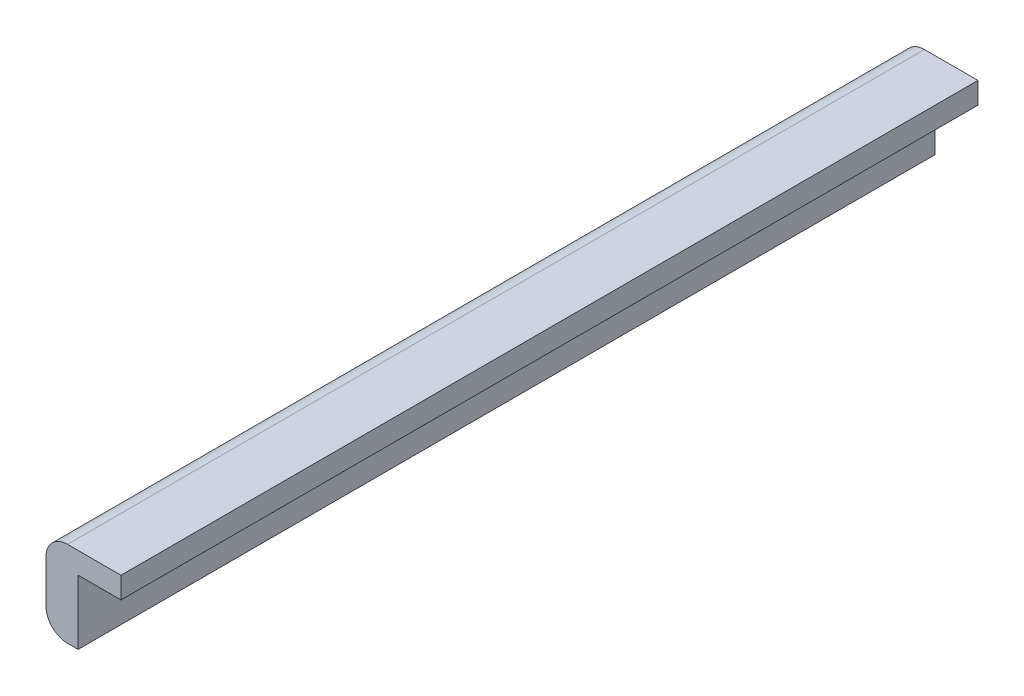
ISO-10303-21;
HEADER;
FILE_DESCRIPTION(('STEP AP214'),'2;1');
FILE_NAME('part.step','',(''),(''),'','','');
FILE_SCHEMA(('AUTOMOTIVE_DESIGN { 1 0 10303 214 1 1 1 1 }'));
ENDSEC;
DATA;
#1=APPLICATION_CONTEXT('core data for automotive mechanical design processes');
#2=APPLICATION_PROTOCOL_DEFINITION('international standard','automotive_design',2000,#1);
#3=PRODUCT_CONTEXT('',#1,'mechanical');
#4=PRODUCT('Part','Part','',(#3));
#5=PRODUCT_RELATED_PRODUCT_CATEGORY('part','',(#4));
#6=PRODUCT_DEFINITION_FORMATION('','',#4);
#7=PRODUCT_DEFINITION_CONTEXT('part definition',#1,'design');
#8=PRODUCT_DEFINITION('design','',#6,#7);
#9=PRODUCT_DEFINITION_SHAPE('','',#8);
#10=(LENGTH_UNIT() NAMED_UNIT(*) SI_UNIT(.MILLI.,.METRE.));
#11=(NAMED_UNIT(*) PLANE_ANGLE_UNIT() SI_UNIT($,.RADIAN.));
#12=(NAMED_UNIT(*) SI_UNIT($,.STERADIAN.) SOLID_ANGLE_UNIT());
#13=UNCERTAINTY_MEASURE_WITH_UNIT(LENGTH_MEASURE(1.E-05),#10,'distance_accuracy_value','');
#14=(GEOMETRIC_REPRESENTATION_CONTEXT(3) GLOBAL_UNCERTAINTY_ASSIGNED_CONTEXT((#13)) GLOBAL_UNIT_ASSIGNED_CONTEXT((#10,
#11,#12)) REPRESENTATION_CONTEXT('',''));
#15=CARTESIAN_POINT('',(0.,0.,0.));
#16=DIRECTION('',(0.,0.,1.));
#17=DIRECTION('',(1.,0.,0.));
#18=AXIS2_PLACEMENT_3D('',#15,#16,#17);
#19=CARTESIAN_POINT('',(4.,0.,80.));
#20=DIRECTION('',(0.,1.,0.));
#21=DIRECTION('',(-1.,0.,0.));
#22=AXIS2_PLACEMENT_3D('',#19,#20,#21);
#23=PLANE('',#22);
#24=DIRECTION('',(1.,0.,0.));
#25=VECTOR('',#24,1.);
#26=CARTESIAN_POINT('',(4.,0.,0.));
#27=LINE('',#26,#25);
#28=CARTESIAN_POINT('',(0.,0.,0.));
#29=VERTEX_POINT('',#28);
#30=CARTESIAN_POINT('',(4.,0.,0.));
#31=VERTEX_POINT('',#30);
#32=EDGE_CURVE('E129',#29,#31,#27,.T.);
#33=ORIENTED_EDGE('',*,*,#32,.T.);
#34=DIRECTION('',(0.,0.,-1.));
#35=VECTOR('',#34,1.);
#36=CARTESIAN_POINT('',(4.,0.,80.));
#37=LINE('',#36,#35);
#38=CARTESIAN_POINT('',(4.,0.,80.));
#39=VERTEX_POINT('',#38);
#40=EDGE_CURVE('E11',#39,#31,#37,.T.);
#41=ORIENTED_EDGE('',*,*,#40,.F.);
#42=DIRECTION('',(1.,0.,0.));
#43=VECTOR('',#42,1.);
#44=CARTESIAN_POINT('',(4.,0.,80.));
#45=LINE('',#44,#43);
#46=CARTESIAN_POINT('',(0.,0.,80.));
#47=VERTEX_POINT('',#46);
#48=EDGE_CURVE('E143',#47,#39,#45,.T.);
#49=ORIENTED_EDGE('',*,*,#48,.F.);
#50=DIRECTION('',(0.,0.,-1.));
#51=VECTOR('',#50,1.);
#52=CARTESIAN_POINT('',(0.,0.,80.));
#53=LINE('',#52,#51);
#54=EDGE_CURVE('E125',#47,#29,#53,.T.);
#55=ORIENTED_EDGE('',*,*,#54,.T.);
#56=EDGE_LOOP('',(#33,#41,#49,#55));
#57=FACE_BOUND('',#56,.T.);
#58=ADVANCED_FACE('F33',(#57),#23,.F.);
#59=CARTESIAN_POINT('',(4.,2.,80.));
#60=DIRECTION('',(-1.,0.,0.));
#61=DIRECTION('',(0.,-1.,0.));
#62=AXIS2_PLACEMENT_3D('',#59,#60,#61);
#63=PLANE('',#62);
#64=DIRECTION('',(0.,1.,0.));
#65=VECTOR('',#64,1.);
#66=CARTESIAN_POINT('',(4.,2.,0.));
#67=LINE('',#66,#65);
#68=CARTESIAN_POINT('',(4.,2.,0.));
#69=VERTEX_POINT('',#68);
#70=EDGE_CURVE('E132',#31,#69,#67,.T.);
#71=ORIENTED_EDGE('',*,*,#70,.T.);
#72=DIRECTION('',(0.,0.,-1.));
#73=VECTOR('',#72,1.);
#74=CARTESIAN_POINT('',(4.,2.,80.));
#75=LINE('',#74,#73);
#76=CARTESIAN_POINT('',(4.,2.,80.));
#77=VERTEX_POINT('',#76);
#78=EDGE_CURVE('E41',#77,#69,#75,.T.);
#79=ORIENTED_EDGE('',*,*,#78,.F.);
#80=DIRECTION('',(0.,1.,0.));
#81=VECTOR('',#80,1.);
#82=CARTESIAN_POINT('',(4.,2.,80.));
#83=LINE('',#82,#81);
#84=EDGE_CURVE('E92',#39,#77,#83,.T.);
#85=ORIENTED_EDGE('',*,*,#84,.F.);
#86=ORIENTED_EDGE('',*,*,#40,.T.);
#87=EDGE_LOOP('',(#71,#79,#85,#86));
#88=FACE_BOUND('',#87,.T.);
#89=ADVANCED_FACE('F178',(#88),#63,.F.);
#90=CARTESIAN_POINT('',(-0.999999999999985,2.,80.));
#91=DIRECTION('',(0.,-1.,0.));
#92=DIRECTION('',(0.,0.,-1.));
#93=AXIS2_PLACEMENT_3D('',#90,#91,#92);
#94=PLANE('',#93);
#95=DIRECTION('',(-1.,0.,0.));
#96=VECTOR('',#95,1.);
#97=CARTESIAN_POINT('',(-0.999999999999985,2.,0.));
#98=LINE('',#97,#96);
#99=CARTESIAN_POINT('',(-0.999999999999985,2.,0.));
#100=VERTEX_POINT('',#99);
#101=EDGE_CURVE('E134',#69,#100,#98,.T.);
#102=ORIENTED_EDGE('',*,*,#101,.T.);
#103=DIRECTION('',(0.,0.,-1.));
#104=VECTOR('',#103,1.);
#105=CARTESIAN_POINT('',(-0.999999999999985,2.,80.));
#106=LINE('',#105,#104);
#107=CARTESIAN_POINT('',(-0.999999999999985,2.,80.));
#108=VERTEX_POINT('',#107);
#109=EDGE_CURVE('E150',#108,#100,#106,.T.);
#110=ORIENTED_EDGE('',*,*,#109,.F.);
#111=DIRECTION('',(-1.,0.,0.));
#112=VECTOR('',#111,1.);
#113=CARTESIAN_POINT('',(-0.999999999999985,2.,80.));
#114=LINE('',#113,#112);
#115=EDGE_CURVE('E158',#77,#108,#114,.T.);
#116=ORIENTED_EDGE('',*,*,#115,.F.);
#117=ORIENTED_EDGE('',*,*,#78,.T.);
#118=EDGE_LOOP('',(#102,#110,#116,#117));
#119=FACE_BOUND('',#118,.T.);
#120=ADVANCED_FACE('F156',(#119),#94,.F.);
#121=CARTESIAN_POINT('',(-0.999999999999999,0.,80.));
#122=DIRECTION('',(0.,0.,-1.));
#123=DIRECTION('',(-1.,0.,0.));
#124=AXIS2_PLACEMENT_3D('',#121,#122,#123);
#125=CYLINDRICAL_SURFACE('',#124,2.);
#126=CARTESIAN_POINT('',(-0.999999999999999,0.,0.));
#127=DIRECTION('',(0.,0.,1.));
#128=DIRECTION('',(-1.,0.,0.));
#129=AXIS2_PLACEMENT_3D('',#126,#127,#128);
#130=CIRCLE('',#129,2.);
#131=CARTESIAN_POINT('',(-3.,0.,0.));
#132=VERTEX_POINT('',#131);
#133=EDGE_CURVE('E136',#100,#132,#130,.T.);
#134=ORIENTED_EDGE('',*,*,#133,.T.);
#135=DIRECTION('',(0.,0.,-1.));
#136=VECTOR('',#135,1.);
#137=CARTESIAN_POINT('',(-3.,0.,80.));
#138=LINE('',#137,#136);
#139=CARTESIAN_POINT('',(-3.,0.,80.));
#140=VERTEX_POINT('',#139);
#141=EDGE_CURVE('E147',#140,#132,#138,.T.);
#142=ORIENTED_EDGE('',*,*,#141,.F.);
#143=CARTESIAN_POINT('',(-0.999999999999999,0.,80.));
#144=DIRECTION('',(0.,0.,1.));
#145=DIRECTION('',(-1.,0.,0.));
#146=AXIS2_PLACEMENT_3D('',#143,#144,#145);
#147=CIRCLE('',#146,2.);
#148=EDGE_CURVE('E170',#108,#140,#147,.T.);
#149=ORIENTED_EDGE('',*,*,#148,.F.);
#150=ORIENTED_EDGE('',*,*,#109,.T.);
#151=EDGE_LOOP('',(#134,#142,#149,#150));
#152=FACE_BOUND('',#151,.T.);
#153=ADVANCED_FACE('F166',(#152),#125,.T.);
#154=CARTESIAN_POINT('',(-3.,-3.99999999999999,80.));
#155=DIRECTION('',(1.,0.,0.));
#156=DIRECTION('',(0.,0.,-1.));
#157=AXIS2_PLACEMENT_3D('',#154,#155,#156);
#158=PLANE('',#157);
#159=DIRECTION('',(0.,-1.,0.));
#160=VECTOR('',#159,1.);
#161=CARTESIAN_POINT('',(-3.,-3.99999999999999,0.));
#162=LINE('',#161,#160);
#163=CARTESIAN_POINT('',(-3.,-4.,0.));
#164=VERTEX_POINT('',#163);
#165=EDGE_CURVE('E138',#132,#164,#162,.T.);
#166=ORIENTED_EDGE('',*,*,#165,.T.);
#167=DIRECTION('',(0.,0.,-1.));
#168=VECTOR('',#167,1.);
#169=CARTESIAN_POINT('',(-3.,-4.,80.));
#170=LINE('',#169,#168);
#171=CARTESIAN_POINT('',(-3.,-4.,80.));
#172=VERTEX_POINT('',#171);
#173=EDGE_CURVE('E120',#172,#164,#170,.T.);
#174=ORIENTED_EDGE('',*,*,#173,.F.);
#175=DIRECTION('',(0.,-1.,0.));
#176=VECTOR('',#175,1.);
#177=CARTESIAN_POINT('',(-3.,-3.99999999999999,80.));
#178=LINE('',#177,#176);
#179=EDGE_CURVE('E111',#140,#172,#178,.T.);
#180=ORIENTED_EDGE('',*,*,#179,.F.);
#181=ORIENTED_EDGE('',*,*,#141,.T.);
#182=EDGE_LOOP('',(#166,#174,#180,#181));
#183=FACE_BOUND('',#182,.T.);
#184=ADVANCED_FACE('F169',(#183),#158,.F.);
#185=CARTESIAN_POINT('',(-0.999999999999999,-4.,80.));
#186=DIRECTION('',(0.,0.,-1.));
#187=DIRECTION('',(-1.,0.,0.));
#188=AXIS2_PLACEMENT_3D('',#185,#186,#187);
#189=CYLINDRICAL_SURFACE('',#188,2.);
#190=CARTESIAN_POINT('',(-0.999999999999999,-4.,0.));
#191=DIRECTION('',(0.,0.,1.));
#192=DIRECTION('',(-1.,0.,0.));
#193=AXIS2_PLACEMENT_3D('',#190,#191,#192);
#194=CIRCLE('',#193,2.);
#195=CARTESIAN_POINT('',(-0.999999999999985,-6.,0.));
#196=VERTEX_POINT('',#195);
#197=EDGE_CURVE('E119',#164,#196,#194,.T.);
#198=ORIENTED_EDGE('',*,*,#197,.T.);
#199=DIRECTION('',(0.,0.,-1.));
#200=VECTOR('',#199,1.);
#201=CARTESIAN_POINT('',(-0.999999999999985,-6.,80.));
#202=LINE('',#201,#200);
#203=CARTESIAN_POINT('',(-0.999999999999985,-6.,80.));
#204=VERTEX_POINT('',#203);
#205=EDGE_CURVE('E116',#204,#196,#202,.T.);
#206=ORIENTED_EDGE('',*,*,#205,.F.);
#207=CARTESIAN_POINT('',(-0.999999999999999,-4.,80.));
#208=DIRECTION('',(0.,0.,1.));
#209=DIRECTION('',(-1.,0.,0.));
#210=AXIS2_PLACEMENT_3D('',#207,#208,#209);
#211=CIRCLE('',#210,2.);
#212=EDGE_CURVE('E105',#172,#204,#211,.T.);
#213=ORIENTED_EDGE('',*,*,#212,.F.);
#214=ORIENTED_EDGE('',*,*,#173,.T.);
#215=EDGE_LOOP('',(#198,#206,#213,#214));
#216=FACE_BOUND('',#215,.T.);
#217=ADVANCED_FACE('F117',(#216),#189,.T.);
#218=CARTESIAN_POINT('',(0.,-6.,80.));
#219=DIRECTION('',(0.,1.,0.));
#220=DIRECTION('',(0.,0.,1.));
#221=AXIS2_PLACEMENT_3D('',#218,#219,#220);
#222=PLANE('',#221);
#223=DIRECTION('',(1.,0.,0.));
#224=VECTOR('',#223,1.);
#225=CARTESIAN_POINT('',(0.,-6.,0.));
#226=LINE('',#225,#224);
#227=CARTESIAN_POINT('',(0.,-6.,0.));
#228=VERTEX_POINT('',#227);
#229=EDGE_CURVE('E78',#196,#228,#226,.T.);
#230=ORIENTED_EDGE('',*,*,#229,.T.);
#231=DIRECTION('',(0.,0.,-1.));
#232=VECTOR('',#231,1.);
#233=CARTESIAN_POINT('',(0.,-6.,80.));
#234=LINE('',#233,#232);
#235=CARTESIAN_POINT('',(0.,-6.,80.));
#236=VERTEX_POINT('',#235);
#237=EDGE_CURVE('E121',#236,#228,#234,.T.);
#238=ORIENTED_EDGE('',*,*,#237,.F.);
#239=DIRECTION('',(1.,0.,0.));
#240=VECTOR('',#239,1.);
#241=CARTESIAN_POINT('',(0.,-6.,80.));
#242=LINE('',#241,#240);
#243=EDGE_CURVE('E109',#204,#236,#242,.T.);
#244=ORIENTED_EDGE('',*,*,#243,.F.);
#245=ORIENTED_EDGE('',*,*,#205,.T.);
#246=EDGE_LOOP('',(#230,#238,#244,#245));
#247=FACE_BOUND('',#246,.T.);
#248=ADVANCED_FACE('F123',(#247),#222,.F.);
#249=CARTESIAN_POINT('',(0.,0.,80.));
#250=DIRECTION('',(-1.,0.,0.));
#251=DIRECTION('',(0.,-1.,0.));
#252=AXIS2_PLACEMENT_3D('',#249,#250,#251);
#253=PLANE('',#252);
#254=DIRECTION('',(0.,1.,0.));
#255=VECTOR('',#254,1.);
#256=CARTESIAN_POINT('',(0.,0.,0.));
#257=LINE('',#256,#255);
#258=EDGE_CURVE('E84',#228,#29,#257,.T.);
#259=ORIENTED_EDGE('',*,*,#258,.T.);
#260=ORIENTED_EDGE('',*,*,#54,.F.);
#261=DIRECTION('',(0.,1.,0.));
#262=VECTOR('',#261,1.);
#263=CARTESIAN_POINT('',(0.,0.,80.));
#264=LINE('',#263,#262);
#265=EDGE_CURVE('E49',#236,#47,#264,.T.);
#266=ORIENTED_EDGE('',*,*,#265,.F.);
#267=ORIENTED_EDGE('',*,*,#237,.T.);
#268=EDGE_LOOP('',(#259,#260,#266,#267));
#269=FACE_BOUND('',#268,.T.);
#270=ADVANCED_FACE('F194',(#269),#253,.F.);
#271=CARTESIAN_POINT('',(-0.999999999999999,-4.,80.));
#272=DIRECTION('',(0.,0.,-1.));
#273=DIRECTION('',(-1.,0.,0.));
#274=AXIS2_PLACEMENT_3D('',#271,#272,#273);
#275=PLANE('',#274);
#276=ORIENTED_EDGE('',*,*,#48,.T.);
#277=ORIENTED_EDGE('',*,*,#84,.T.);
#278=ORIENTED_EDGE('',*,*,#115,.T.);
#279=ORIENTED_EDGE('',*,*,#148,.T.);
#280=ORIENTED_EDGE('',*,*,#179,.T.);
#281=ORIENTED_EDGE('',*,*,#212,.T.);
#282=ORIENTED_EDGE('',*,*,#243,.T.);
#283=ORIENTED_EDGE('',*,*,#265,.T.);
#284=EDGE_LOOP('',(#276,#277,#278,#279,#280,#281,#282,#283));
#285=FACE_BOUND('',#284,.T.);
#286=ADVANCED_FACE('F107',(#285),#275,.F.);
#287=CARTESIAN_POINT('',(-0.999999999999999,-4.,0.));
#288=DIRECTION('',(0.,0.,-1.));
#289=DIRECTION('',(-1.,0.,0.));
#290=AXIS2_PLACEMENT_3D('',#287,#288,#289);
#291=PLANE('',#290);
#292=ORIENTED_EDGE('',*,*,#32,.F.);
#293=ORIENTED_EDGE('',*,*,#258,.F.);
#294=ORIENTED_EDGE('',*,*,#229,.F.);
#295=ORIENTED_EDGE('',*,*,#197,.F.);
#296=ORIENTED_EDGE('',*,*,#165,.F.);
#297=ORIENTED_EDGE('',*,*,#133,.F.);
#298=ORIENTED_EDGE('',*,*,#101,.F.);
#299=ORIENTED_EDGE('',*,*,#70,.F.);
#300=EDGE_LOOP('',(#292,#293,#294,#295,#296,#297,#298,#299));
#301=FACE_BOUND('',#300,.T.);
#302=ADVANCED_FACE('F162',(#301),#291,.T.);
#303=CLOSED_SHELL('',(#58,#89,#120,#153,#184,#217,#248,#270,#286,#302));
#304=MANIFOLD_SOLID_BREP('B2',#303);
#305=ADVANCED_BREP_SHAPE_REPRESENTATION('',(#18,#304),#14);
#306=SHAPE_DEFINITION_REPRESENTATION(#9,#305);
ENDSEC;
END-ISO-10303-21;
